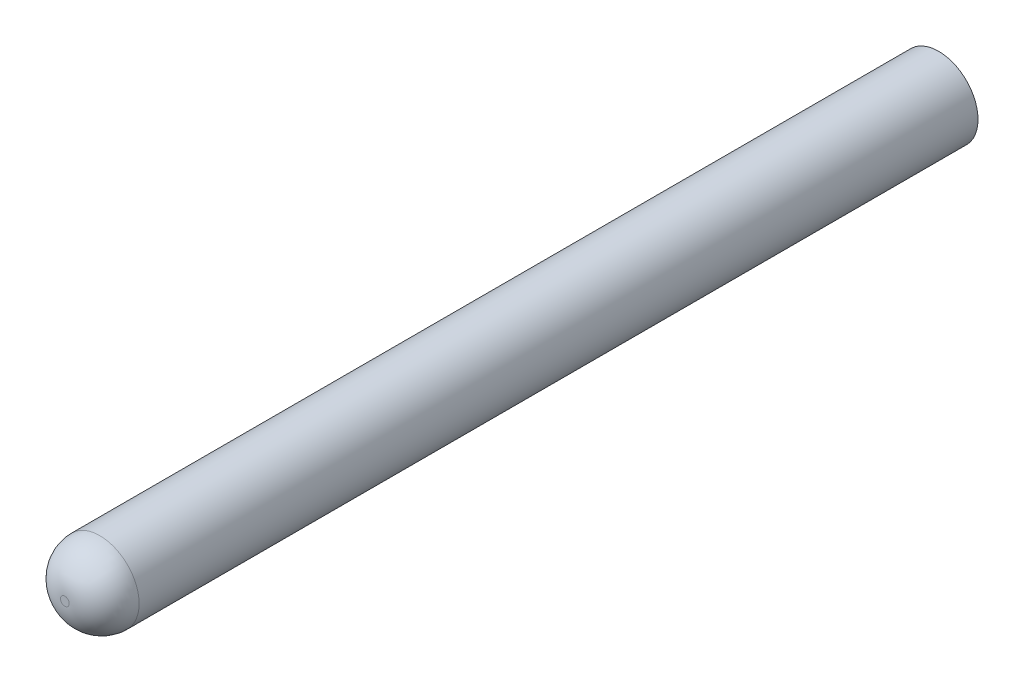
ISO-10303-21;
HEADER;
FILE_DESCRIPTION(('STEP AP214'),'2;1');
FILE_NAME('part.step','',(''),(''),'','','');
FILE_SCHEMA(('AUTOMOTIVE_DESIGN { 1 0 10303 214 1 1 1 1 }'));
ENDSEC;
DATA;
#1=APPLICATION_CONTEXT('core data for automotive mechanical design processes');
#2=APPLICATION_PROTOCOL_DEFINITION('international standard','automotive_design',2000,#1);
#3=PRODUCT_CONTEXT('',#1,'mechanical');
#4=PRODUCT('Part','Part','',(#3));
#5=PRODUCT_RELATED_PRODUCT_CATEGORY('part','',(#4));
#6=PRODUCT_DEFINITION_FORMATION('','',#4);
#7=PRODUCT_DEFINITION_CONTEXT('part definition',#1,'design');
#8=PRODUCT_DEFINITION('design','',#6,#7);
#9=PRODUCT_DEFINITION_SHAPE('','',#8);
#10=(LENGTH_UNIT() NAMED_UNIT(*) SI_UNIT(.MILLI.,.METRE.));
#11=(NAMED_UNIT(*) PLANE_ANGLE_UNIT() SI_UNIT($,.RADIAN.));
#12=(NAMED_UNIT(*) SI_UNIT($,.STERADIAN.) SOLID_ANGLE_UNIT());
#13=UNCERTAINTY_MEASURE_WITH_UNIT(LENGTH_MEASURE(1.E-05),#10,'distance_accuracy_value','');
#14=(GEOMETRIC_REPRESENTATION_CONTEXT(3) GLOBAL_UNCERTAINTY_ASSIGNED_CONTEXT((#13)) GLOBAL_UNIT_ASSIGNED_CONTEXT((#10,
#11,#12)) REPRESENTATION_CONTEXT('',''));
#15=CARTESIAN_POINT('',(0.,0.,0.));
#16=DIRECTION('',(0.,0.,1.));
#17=DIRECTION('',(1.,0.,0.));
#18=AXIS2_PLACEMENT_3D('',#15,#16,#17);
#19=CARTESIAN_POINT('',(0.,0.,100.));
#20=DIRECTION('',(0.,0.,-1.));
#21=DIRECTION('',(-1.,0.,0.));
#22=AXIS2_PLACEMENT_3D('',#19,#20,#21);
#23=CYLINDRICAL_SURFACE('',#22,4.5);
#24=CARTESIAN_POINT('',(0.,0.,96.));
#25=DIRECTION('',(0.,0.,1.));
#26=DIRECTION('',(1.,0.,0.));
#27=AXIS2_PLACEMENT_3D('',#24,#25,#26);
#28=CIRCLE('',#27,4.5);
#29=CARTESIAN_POINT('',(4.5,0.,96.));
#30=VERTEX_POINT('',#29);
#31=EDGE_CURVE('E10',#30,#30,#28,.F.);
#32=ORIENTED_EDGE('',*,*,#31,.T.);
#33=EDGE_LOOP('',(#32));
#34=FACE_BOUND('',#33,.T.);
#35=CARTESIAN_POINT('',(0.,0.,0.));
#36=DIRECTION('',(0.,0.,1.));
#37=DIRECTION('',(1.,0.,0.));
#38=AXIS2_PLACEMENT_3D('',#35,#36,#37);
#39=CIRCLE('',#38,4.5);
#40=CARTESIAN_POINT('',(4.5,0.,0.));
#41=VERTEX_POINT('',#40);
#42=EDGE_CURVE('E44',#41,#41,#39,.T.);
#43=ORIENTED_EDGE('',*,*,#42,.T.);
#44=EDGE_LOOP('',(#43));
#45=FACE_BOUND('',#44,.T.);
#46=ADVANCED_FACE('F33',(#34,#45),#23,.T.);
#47=CARTESIAN_POINT('',(0.,0.,100.));
#48=DIRECTION('',(0.,0.,1.));
#49=DIRECTION('',(1.,0.,0.));
#50=AXIS2_PLACEMENT_3D('',#47,#48,#49);
#51=PLANE('',#50);
#52=CARTESIAN_POINT('',(0.,0.,100.));
#53=DIRECTION('',(0.,0.,1.));
#54=DIRECTION('',(1.,0.,0.));
#55=AXIS2_PLACEMENT_3D('',#52,#53,#54);
#56=CIRCLE('',#55,0.499999999999999);
#57=CARTESIAN_POINT('',(0.499999999999999,0.,100.));
#58=VERTEX_POINT('',#57);
#59=EDGE_CURVE('E40',#58,#58,#56,.T.);
#60=ORIENTED_EDGE('',*,*,#59,.T.);
#61=EDGE_LOOP('',(#60));
#62=FACE_BOUND('',#61,.T.);
#63=ADVANCED_FACE('F54',(#62),#51,.T.);
#64=CARTESIAN_POINT('',(0.,0.,0.));
#65=DIRECTION('',(0.,0.,1.));
#66=DIRECTION('',(1.,0.,0.));
#67=AXIS2_PLACEMENT_3D('',#64,#65,#66);
#68=PLANE('',#67);
#69=ORIENTED_EDGE('',*,*,#42,.F.);
#70=EDGE_LOOP('',(#69));
#71=FACE_BOUND('',#70,.T.);
#72=ADVANCED_FACE('F52',(#71),#68,.F.);
#73=CARTESIAN_POINT('',(0.,0.,96.));
#74=DIRECTION('',(0.,0.,1.));
#75=DIRECTION('',(1.,0.,0.));
#76=AXIS2_PLACEMENT_3D('',#73,#74,#75);
#77=DEGENERATE_TOROIDAL_SURFACE('',#76,0.499999999999999,4.,.T.);
#78=ORIENTED_EDGE('',*,*,#31,.F.);
#79=EDGE_LOOP('',(#78));
#80=FACE_BOUND('',#79,.T.);
#81=ORIENTED_EDGE('',*,*,#59,.F.);
#82=EDGE_LOOP('',(#81));
#83=FACE_BOUND('',#82,.T.);
#84=ADVANCED_FACE('F35',(#80,#83),#77,.T.);
#85=CLOSED_SHELL('',(#46,#63,#72,#84));
#86=MANIFOLD_SOLID_BREP('B2',#85);
#87=ADVANCED_BREP_SHAPE_REPRESENTATION('',(#18,#86),#14);
#88=SHAPE_DEFINITION_REPRESENTATION(#9,#87);
ENDSEC;
END-ISO-10303-21;
